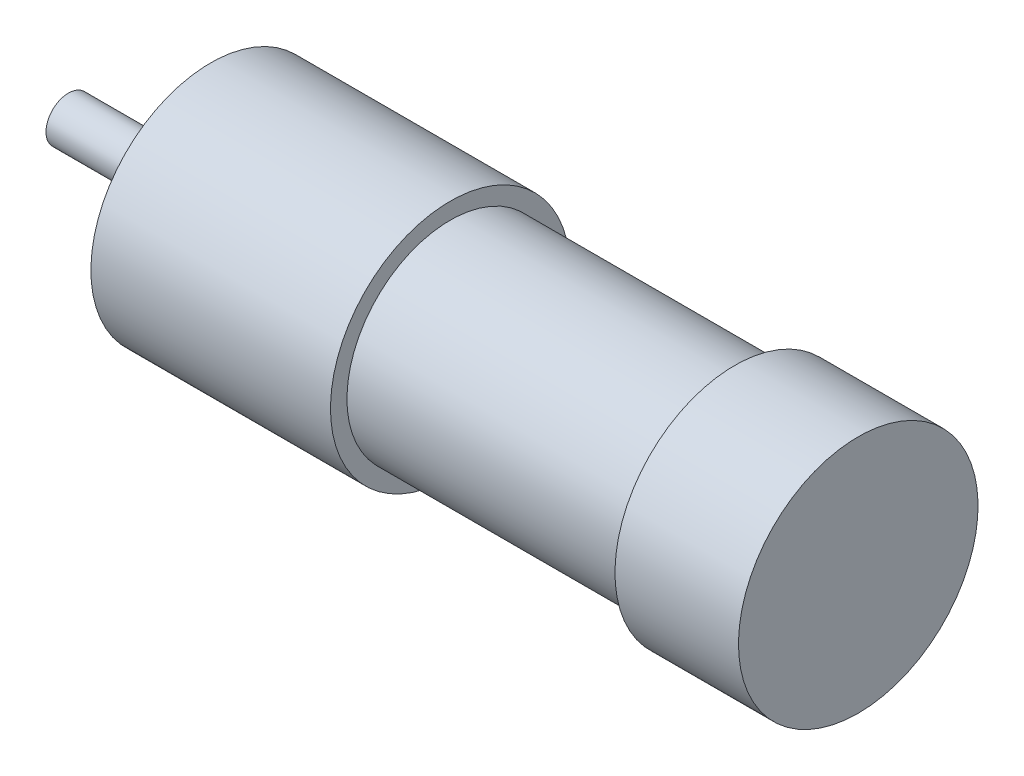
ISO-10303-21;
HEADER;
FILE_DESCRIPTION(('STEP AP214'),'2;1');
FILE_NAME('part.step','',(''),(''),'','','');
FILE_SCHEMA(('AUTOMOTIVE_DESIGN { 1 0 10303 214 1 1 1 1 }'));
ENDSEC;
DATA;
#1=APPLICATION_CONTEXT('core data for automotive mechanical design processes');
#2=APPLICATION_PROTOCOL_DEFINITION('international standard','automotive_design',2000,#1);
#3=PRODUCT_CONTEXT('',#1,'mechanical');
#4=PRODUCT('Part','Part','',(#3));
#5=PRODUCT_RELATED_PRODUCT_CATEGORY('part','',(#4));
#6=PRODUCT_DEFINITION_FORMATION('','',#4);
#7=PRODUCT_DEFINITION_CONTEXT('part definition',#1,'design');
#8=PRODUCT_DEFINITION('design','',#6,#7);
#9=PRODUCT_DEFINITION_SHAPE('','',#8);
#10=(LENGTH_UNIT() NAMED_UNIT(*) SI_UNIT(.MILLI.,.METRE.));
#11=(NAMED_UNIT(*) PLANE_ANGLE_UNIT() SI_UNIT($,.RADIAN.));
#12=(NAMED_UNIT(*) SI_UNIT($,.STERADIAN.) SOLID_ANGLE_UNIT());
#13=UNCERTAINTY_MEASURE_WITH_UNIT(LENGTH_MEASURE(1.E-05),#10,'distance_accuracy_value','');
#14=(GEOMETRIC_REPRESENTATION_CONTEXT(3) GLOBAL_UNCERTAINTY_ASSIGNED_CONTEXT((#13)) GLOBAL_UNIT_ASSIGNED_CONTEXT((#10,
#11,#12)) REPRESENTATION_CONTEXT('',''));
#15=CARTESIAN_POINT('',(0.,0.,0.));
#16=DIRECTION('',(0.,0.,1.));
#17=DIRECTION('',(1.,0.,0.));
#18=AXIS2_PLACEMENT_3D('',#15,#16,#17);
#19=CARTESIAN_POINT('',(0.,0.,0.));
#20=DIRECTION('',(1.,0.,0.));
#21=DIRECTION('',(0.,1.,0.));
#22=AXIS2_PLACEMENT_3D('',#19,#20,#21);
#23=PLANE('',#22);
#24=CARTESIAN_POINT('',(0.,0.,0.));
#25=DIRECTION('',(-1.,0.,0.));
#26=DIRECTION('',(0.,-1.,0.));
#27=AXIS2_PLACEMENT_3D('',#24,#25,#26);
#28=CIRCLE('',#27,3.);
#29=CARTESIAN_POINT('',(0.,-3.,0.));
#30=VERTEX_POINT('',#29);
#31=EDGE_CURVE('E11',#30,#30,#28,.T.);
#32=ORIENTED_EDGE('',*,*,#31,.F.);
#33=EDGE_LOOP('',(#32));
#34=FACE_BOUND('',#33,.T.);
#35=DIRECTION('',(0.,0.,1.));
#36=VECTOR('',#35,1.);
#37=CARTESIAN_POINT('',(0.,-9.,0.));
#38=LINE('',#37,#36);
#39=CARTESIAN_POINT('',(0.,-9.,-4.35889894354067));
#40=VERTEX_POINT('',#39);
#41=CARTESIAN_POINT('',(0.,-9.,4.35889894354067));
#42=VERTEX_POINT('',#41);
#43=EDGE_CURVE('E82',#40,#42,#38,.T.);
#44=ORIENTED_EDGE('',*,*,#43,.T.);
#45=CARTESIAN_POINT('',(0.,0.,0.));
#46=DIRECTION('',(-1.,0.,0.));
#47=DIRECTION('',(0.,-1.,0.));
#48=AXIS2_PLACEMENT_3D('',#45,#46,#47);
#49=CIRCLE('',#48,10.);
#50=CARTESIAN_POINT('',(0.,9.,4.35889894354068));
#51=VERTEX_POINT('',#50);
#52=EDGE_CURVE('E46',#42,#51,#49,.T.);
#53=ORIENTED_EDGE('',*,*,#52,.T.);
#54=DIRECTION('',(0.,0.,1.));
#55=VECTOR('',#54,1.);
#56=CARTESIAN_POINT('',(0.,9.,0.));
#57=LINE('',#56,#55);
#58=CARTESIAN_POINT('',(0.,9.,-4.35889894354068));
#59=VERTEX_POINT('',#58);
#60=EDGE_CURVE('E103',#59,#51,#57,.T.);
#61=ORIENTED_EDGE('',*,*,#60,.F.);
#62=EDGE_CURVE('E99',#59,#40,#49,.T.);
#63=ORIENTED_EDGE('',*,*,#62,.T.);
#64=EDGE_LOOP('',(#44,#53,#61,#63));
#65=FACE_BOUND('',#64,.T.);
#66=ADVANCED_FACE('F43',(#34,#65),#23,.F.);
#67=CARTESIAN_POINT('',(0.,0.,0.));
#68=DIRECTION('',(-1.,0.,0.));
#69=DIRECTION('',(0.,-1.,0.));
#70=AXIS2_PLACEMENT_3D('',#67,#68,#69);
#71=CYLINDRICAL_SURFACE('',#70,10.);
#72=DIRECTION('',(-1.,0.,0.));
#73=VECTOR('',#72,1.);
#74=CARTESIAN_POINT('',(3.,-9.,4.35889894354067));
#75=LINE('',#74,#73);
#76=CARTESIAN_POINT('',(3.,-9.,4.35889894354067));
#77=VERTEX_POINT('',#76);
#78=EDGE_CURVE('E88',#77,#42,#75,.T.);
#79=ORIENTED_EDGE('',*,*,#78,.F.);
#80=CARTESIAN_POINT('',(3.,0.,0.));
#81=DIRECTION('',(-1.,0.,0.));
#82=DIRECTION('',(0.,-1.,0.));
#83=AXIS2_PLACEMENT_3D('',#80,#81,#82);
#84=CIRCLE('',#83,10.);
#85=CARTESIAN_POINT('',(3.,9.,4.35889894354067));
#86=VERTEX_POINT('',#85);
#87=EDGE_CURVE('E104',#77,#86,#84,.T.);
#88=ORIENTED_EDGE('',*,*,#87,.T.);
#89=DIRECTION('',(-1.,0.,0.));
#90=VECTOR('',#89,1.);
#91=CARTESIAN_POINT('',(3.,9.,4.35889894354068));
#92=LINE('',#91,#90);
#93=EDGE_CURVE('E93',#86,#51,#92,.T.);
#94=ORIENTED_EDGE('',*,*,#93,.T.);
#95=ORIENTED_EDGE('',*,*,#52,.F.);
#96=EDGE_LOOP('',(#79,#88,#94,#95));
#97=FACE_BOUND('',#96,.T.);
#98=ADVANCED_FACE('F160',(#97),#71,.T.);
#99=DIRECTION('',(-1.,0.,0.));
#100=VECTOR('',#99,1.);
#101=CARTESIAN_POINT('',(3.,-9.,-4.35889894354067));
#102=LINE('',#101,#100);
#103=CARTESIAN_POINT('',(3.,-9.,-4.35889894354067));
#104=VERTEX_POINT('',#103);
#105=EDGE_CURVE('E85',#104,#40,#102,.T.);
#106=ORIENTED_EDGE('',*,*,#105,.T.);
#107=ORIENTED_EDGE('',*,*,#62,.F.);
#108=DIRECTION('',(-1.,0.,0.));
#109=VECTOR('',#108,1.);
#110=CARTESIAN_POINT('',(3.,9.,-4.35889894354068));
#111=LINE('',#110,#109);
#112=CARTESIAN_POINT('',(3.,9.,-4.35889894354068));
#113=VERTEX_POINT('',#112);
#114=EDGE_CURVE('E154',#113,#59,#111,.T.);
#115=ORIENTED_EDGE('',*,*,#114,.F.);
#116=EDGE_CURVE('E100',#113,#104,#84,.T.);
#117=ORIENTED_EDGE('',*,*,#116,.T.);
#118=EDGE_LOOP('',(#106,#107,#115,#117));
#119=FACE_BOUND('',#118,.T.);
#120=ADVANCED_FACE('F97',(#119),#71,.T.);
#121=CARTESIAN_POINT('',(3.,10.,0.));
#122=DIRECTION('',(1.,0.,0.));
#123=DIRECTION('',(0.,1.,0.));
#124=AXIS2_PLACEMENT_3D('',#121,#122,#123);
#125=PLANE('',#124);
#126=CARTESIAN_POINT('',(3.,9.19238815542484,-9.19238815542514));
#127=DIRECTION('',(-1.,0.,0.));
#128=DIRECTION('',(0.,-1.,0.));
#129=AXIS2_PLACEMENT_3D('',#126,#127,#128);
#130=CIRCLE('',#129,2.);
#131=CARTESIAN_POINT('',(3.,7.19238815542484,-9.19238815542514));
#132=VERTEX_POINT('',#131);
#133=EDGE_CURVE('E137',#132,#132,#130,.T.);
#134=ORIENTED_EDGE('',*,*,#133,.F.);
#135=EDGE_LOOP('',(#134));
#136=FACE_BOUND('',#135,.T.);
#137=CARTESIAN_POINT('',(3.,-9.19238815542539,-9.19238815542484));
#138=DIRECTION('',(-1.,0.,0.));
#139=DIRECTION('',(0.,-1.,0.));
#140=AXIS2_PLACEMENT_3D('',#137,#138,#139);
#141=CIRCLE('',#140,2.);
#142=CARTESIAN_POINT('',(3.,-11.1923881554254,-9.19238815542484));
#143=VERTEX_POINT('',#142);
#144=EDGE_CURVE('E144',#143,#143,#141,.T.);
#145=ORIENTED_EDGE('',*,*,#144,.F.);
#146=EDGE_LOOP('',(#145));
#147=FACE_BOUND('',#146,.T.);
#148=CARTESIAN_POINT('',(3.,-9.1923881554251,9.19238815542539));
#149=DIRECTION('',(-1.,0.,0.));
#150=DIRECTION('',(0.,-1.,0.));
#151=AXIS2_PLACEMENT_3D('',#148,#149,#150);
#152=CIRCLE('',#151,2.);
#153=CARTESIAN_POINT('',(3.,-11.1923881554251,9.19238815542539));
#154=VERTEX_POINT('',#153);
#155=EDGE_CURVE('E131',#154,#154,#152,.T.);
#156=ORIENTED_EDGE('',*,*,#155,.F.);
#157=EDGE_LOOP('',(#156));
#158=FACE_BOUND('',#157,.T.);
#159=CARTESIAN_POINT('',(3.,9.19238815542513,9.1923881554251));
#160=DIRECTION('',(-1.,0.,0.));
#161=DIRECTION('',(0.,-1.,0.));
#162=AXIS2_PLACEMENT_3D('',#159,#160,#161);
#163=CIRCLE('',#162,2.);
#164=CARTESIAN_POINT('',(3.,7.19238815542513,9.1923881554251));
#165=VERTEX_POINT('',#164);
#166=EDGE_CURVE('E128',#165,#165,#163,.T.);
#167=ORIENTED_EDGE('',*,*,#166,.F.);
#168=EDGE_LOOP('',(#167));
#169=FACE_BOUND('',#168,.T.);
#170=ORIENTED_EDGE('',*,*,#87,.F.);
#171=DIRECTION('',(0.,0.,1.));
#172=VECTOR('',#171,1.);
#173=CARTESIAN_POINT('',(3.,-9.,0.));
#174=LINE('',#173,#172);
#175=EDGE_CURVE('E58',#104,#77,#174,.T.);
#176=ORIENTED_EDGE('',*,*,#175,.F.);
#177=ORIENTED_EDGE('',*,*,#116,.F.);
#178=DIRECTION('',(0.,0.,1.));
#179=VECTOR('',#178,1.);
#180=CARTESIAN_POINT('',(3.,9.,0.));
#181=LINE('',#180,#179);
#182=EDGE_CURVE('E63',#113,#86,#181,.T.);
#183=ORIENTED_EDGE('',*,*,#182,.T.);
#184=EDGE_LOOP('',(#170,#176,#177,#183));
#185=FACE_BOUND('',#184,.T.);
#186=CARTESIAN_POINT('',(3.,0.,0.));
#187=DIRECTION('',(-1.,0.,0.));
#188=DIRECTION('',(0.,-1.,0.));
#189=AXIS2_PLACEMENT_3D('',#186,#187,#188);
#190=CIRCLE('',#189,16.);
#191=CARTESIAN_POINT('',(3.,-16.,0.));
#192=VERTEX_POINT('',#191);
#193=EDGE_CURVE('E108',#192,#192,#190,.T.);
#194=ORIENTED_EDGE('',*,*,#193,.T.);
#195=EDGE_LOOP('',(#194));
#196=FACE_BOUND('',#195,.T.);
#197=ADVANCED_FACE('F161',(#136,#147,#158,#169,#185,#196),#125,.F.);
#198=CARTESIAN_POINT('',(0.,0.,0.));
#199=DIRECTION('',(-1.,0.,0.));
#200=DIRECTION('',(0.,-1.,0.));
#201=AXIS2_PLACEMENT_3D('',#198,#199,#200);
#202=CYLINDRICAL_SURFACE('',#201,16.);
#203=ORIENTED_EDGE('',*,*,#193,.F.);
#204=EDGE_LOOP('',(#203));
#205=FACE_BOUND('',#204,.T.);
#206=CARTESIAN_POINT('',(35.,0.,0.));
#207=DIRECTION('',(-1.,0.,0.));
#208=DIRECTION('',(0.,-1.,0.));
#209=AXIS2_PLACEMENT_3D('',#206,#207,#208);
#210=CIRCLE('',#209,16.);
#211=CARTESIAN_POINT('',(35.,-16.,0.));
#212=VERTEX_POINT('',#211);
#213=EDGE_CURVE('E112',#212,#212,#210,.T.);
#214=ORIENTED_EDGE('',*,*,#213,.T.);
#215=EDGE_LOOP('',(#214));
#216=FACE_BOUND('',#215,.T.);
#217=ADVANCED_FACE('F164',(#205,#216),#202,.T.);
#218=CARTESIAN_POINT('',(35.,16.,0.));
#219=DIRECTION('',(-1.,0.,0.));
#220=DIRECTION('',(0.,-1.,0.));
#221=AXIS2_PLACEMENT_3D('',#218,#219,#220);
#222=PLANE('',#221);
#223=ORIENTED_EDGE('',*,*,#213,.F.);
#224=EDGE_LOOP('',(#223));
#225=FACE_BOUND('',#224,.T.);
#226=CARTESIAN_POINT('',(35.,0.,0.));
#227=DIRECTION('',(-1.,0.,0.));
#228=DIRECTION('',(0.,-1.,0.));
#229=AXIS2_PLACEMENT_3D('',#226,#227,#228);
#230=CIRCLE('',#229,13.8);
#231=CARTESIAN_POINT('',(35.,-13.8,0.));
#232=VERTEX_POINT('',#231);
#233=EDGE_CURVE('E115',#232,#232,#230,.T.);
#234=ORIENTED_EDGE('',*,*,#233,.T.);
#235=EDGE_LOOP('',(#234));
#236=FACE_BOUND('',#235,.T.);
#237=ADVANCED_FACE('F171',(#225,#236),#222,.F.);
#238=CARTESIAN_POINT('',(0.,0.,0.));
#239=DIRECTION('',(-1.,0.,0.));
#240=DIRECTION('',(0.,-1.,0.));
#241=AXIS2_PLACEMENT_3D('',#238,#239,#240);
#242=CYLINDRICAL_SURFACE('',#241,13.8);
#243=ORIENTED_EDGE('',*,*,#233,.F.);
#244=EDGE_LOOP('',(#243));
#245=FACE_BOUND('',#244,.T.);
#246=CARTESIAN_POINT('',(73.,0.,0.));
#247=DIRECTION('',(-1.,0.,0.));
#248=DIRECTION('',(0.,-1.,0.));
#249=AXIS2_PLACEMENT_3D('',#246,#247,#248);
#250=CIRCLE('',#249,13.8);
#251=CARTESIAN_POINT('',(73.,-13.8,0.));
#252=VERTEX_POINT('',#251);
#253=EDGE_CURVE('E118',#252,#252,#250,.T.);
#254=ORIENTED_EDGE('',*,*,#253,.T.);
#255=EDGE_LOOP('',(#254));
#256=FACE_BOUND('',#255,.T.);
#257=ADVANCED_FACE('F177',(#245,#256),#242,.T.);
#258=CARTESIAN_POINT('',(89.5,0.,0.));
#259=DIRECTION('',(-1.,0.,0.));
#260=DIRECTION('',(0.,-1.,0.));
#261=AXIS2_PLACEMENT_3D('',#258,#259,#260);
#262=PLANE('',#261);
#263=CARTESIAN_POINT('',(89.5,0.,0.));
#264=DIRECTION('',(-1.,0.,0.));
#265=DIRECTION('',(0.,-1.,0.));
#266=AXIS2_PLACEMENT_3D('',#263,#264,#265);
#267=CIRCLE('',#266,16.);
#268=CARTESIAN_POINT('',(89.5,-16.,0.));
#269=VERTEX_POINT('',#268);
#270=EDGE_CURVE('E121',#269,#269,#267,.T.);
#271=ORIENTED_EDGE('',*,*,#270,.F.);
#272=EDGE_LOOP('',(#271));
#273=FACE_BOUND('',#272,.T.);
#274=ADVANCED_FACE('F183',(#273),#262,.F.);
#275=CARTESIAN_POINT('',(73.,0.,0.));
#276=DIRECTION('',(-1.,0.,0.));
#277=DIRECTION('',(0.,-1.,0.));
#278=AXIS2_PLACEMENT_3D('',#275,#276,#277);
#279=CYLINDRICAL_SURFACE('',#278,16.);
#280=CARTESIAN_POINT('',(73.,0.,0.));
#281=DIRECTION('',(-1.,0.,0.));
#282=DIRECTION('',(0.,-1.,0.));
#283=AXIS2_PLACEMENT_3D('',#280,#281,#282);
#284=CIRCLE('',#283,16.);
#285=CARTESIAN_POINT('',(73.,-16.,0.));
#286=VERTEX_POINT('',#285);
#287=EDGE_CURVE('E124',#286,#286,#284,.T.);
#288=ORIENTED_EDGE('',*,*,#287,.F.);
#289=EDGE_LOOP('',(#288));
#290=FACE_BOUND('',#289,.T.);
#291=ORIENTED_EDGE('',*,*,#270,.T.);
#292=EDGE_LOOP('',(#291));
#293=FACE_BOUND('',#292,.T.);
#294=ADVANCED_FACE('F191',(#290,#293),#279,.T.);
#295=CARTESIAN_POINT('',(73.,16.,0.));
#296=DIRECTION('',(1.,0.,0.));
#297=DIRECTION('',(0.,1.,0.));
#298=AXIS2_PLACEMENT_3D('',#295,#296,#297);
#299=PLANE('',#298);
#300=ORIENTED_EDGE('',*,*,#253,.F.);
#301=EDGE_LOOP('',(#300));
#302=FACE_BOUND('',#301,.T.);
#303=ORIENTED_EDGE('',*,*,#287,.T.);
#304=EDGE_LOOP('',(#303));
#305=FACE_BOUND('',#304,.T.);
#306=ADVANCED_FACE('F187',(#302,#305),#299,.F.);
#307=CARTESIAN_POINT('',(11.,9.19238815542513,9.1923881554251));
#308=DIRECTION('',(-1.,0.,0.));
#309=DIRECTION('',(0.,-1.,0.));
#310=AXIS2_PLACEMENT_3D('',#307,#308,#309);
#311=CYLINDRICAL_SURFACE('',#310,2.);
#312=CARTESIAN_POINT('',(11.,9.19238815542513,9.1923881554251));
#313=DIRECTION('',(-1.,0.,0.));
#314=DIRECTION('',(0.,-1.,0.));
#315=AXIS2_PLACEMENT_3D('',#312,#313,#314);
#316=CIRCLE('',#315,2.);
#317=CARTESIAN_POINT('',(11.,7.19238815542513,9.1923881554251));
#318=VERTEX_POINT('',#317);
#319=EDGE_CURVE('E127',#318,#318,#316,.T.);
#320=ORIENTED_EDGE('',*,*,#319,.F.);
#321=EDGE_LOOP('',(#320));
#322=FACE_BOUND('',#321,.T.);
#323=ORIENTED_EDGE('',*,*,#166,.T.);
#324=EDGE_LOOP('',(#323));
#325=FACE_BOUND('',#324,.T.);
#326=ADVANCED_FACE('F190',(#322,#325),#311,.F.);
#327=CARTESIAN_POINT('',(11.,9.19238815542513,9.1923881554251));
#328=DIRECTION('',(-1.,0.,0.));
#329=DIRECTION('',(0.,-1.,0.));
#330=AXIS2_PLACEMENT_3D('',#327,#328,#329);
#331=PLANE('',#330);
#332=ORIENTED_EDGE('',*,*,#319,.T.);
#333=EDGE_LOOP('',(#332));
#334=FACE_BOUND('',#333,.T.);
#335=ADVANCED_FACE('F234',(#334),#331,.T.);
#336=CARTESIAN_POINT('',(11.,-9.1923881554251,9.19238815542539));
#337=DIRECTION('',(-1.,0.,0.));
#338=DIRECTION('',(0.,-1.,0.));
#339=AXIS2_PLACEMENT_3D('',#336,#337,#338);
#340=CYLINDRICAL_SURFACE('',#339,2.);
#341=CARTESIAN_POINT('',(11.,-9.1923881554251,9.19238815542539));
#342=DIRECTION('',(-1.,0.,0.));
#343=DIRECTION('',(0.,-1.,0.));
#344=AXIS2_PLACEMENT_3D('',#341,#342,#343);
#345=CIRCLE('',#344,2.);
#346=CARTESIAN_POINT('',(11.,-11.1923881554251,9.19238815542539));
#347=VERTEX_POINT('',#346);
#348=EDGE_CURVE('E147',#347,#347,#345,.T.);
#349=ORIENTED_EDGE('',*,*,#348,.F.);
#350=EDGE_LOOP('',(#349));
#351=FACE_BOUND('',#350,.T.);
#352=ORIENTED_EDGE('',*,*,#155,.T.);
#353=EDGE_LOOP('',(#352));
#354=FACE_BOUND('',#353,.T.);
#355=ADVANCED_FACE('F230',(#351,#354),#340,.F.);
#356=CARTESIAN_POINT('',(11.,-9.1923881554251,9.19238815542539));
#357=DIRECTION('',(-1.,0.,0.));
#358=DIRECTION('',(0.,-1.,0.));
#359=AXIS2_PLACEMENT_3D('',#356,#357,#358);
#360=PLANE('',#359);
#361=ORIENTED_EDGE('',*,*,#348,.T.);
#362=EDGE_LOOP('',(#361));
#363=FACE_BOUND('',#362,.T.);
#364=ADVANCED_FACE('F233',(#363),#360,.T.);
#365=CARTESIAN_POINT('',(11.,-9.19238815542539,-9.19238815542484));
#366=DIRECTION('',(-1.,0.,0.));
#367=DIRECTION('',(0.,-1.,0.));
#368=AXIS2_PLACEMENT_3D('',#365,#366,#367);
#369=CYLINDRICAL_SURFACE('',#368,2.);
#370=CARTESIAN_POINT('',(11.,-9.19238815542539,-9.19238815542484));
#371=DIRECTION('',(-1.,0.,0.));
#372=DIRECTION('',(0.,-1.,0.));
#373=AXIS2_PLACEMENT_3D('',#370,#371,#372);
#374=CIRCLE('',#373,2.);
#375=CARTESIAN_POINT('',(11.,-11.1923881554254,-9.19238815542484));
#376=VERTEX_POINT('',#375);
#377=EDGE_CURVE('E141',#376,#376,#374,.T.);
#378=ORIENTED_EDGE('',*,*,#377,.F.);
#379=EDGE_LOOP('',(#378));
#380=FACE_BOUND('',#379,.T.);
#381=ORIENTED_EDGE('',*,*,#144,.T.);
#382=EDGE_LOOP('',(#381));
#383=FACE_BOUND('',#382,.T.);
#384=ADVANCED_FACE('F238',(#380,#383),#369,.F.);
#385=CARTESIAN_POINT('',(11.,-9.19238815542539,-9.19238815542484));
#386=DIRECTION('',(-1.,0.,0.));
#387=DIRECTION('',(0.,-1.,0.));
#388=AXIS2_PLACEMENT_3D('',#385,#386,#387);
#389=PLANE('',#388);
#390=ORIENTED_EDGE('',*,*,#377,.T.);
#391=EDGE_LOOP('',(#390));
#392=FACE_BOUND('',#391,.T.);
#393=ADVANCED_FACE('F242',(#392),#389,.T.);
#394=CARTESIAN_POINT('',(11.,9.19238815542484,-9.19238815542514));
#395=DIRECTION('',(-1.,0.,0.));
#396=DIRECTION('',(0.,-1.,0.));
#397=AXIS2_PLACEMENT_3D('',#394,#395,#396);
#398=CYLINDRICAL_SURFACE('',#397,2.);
#399=CARTESIAN_POINT('',(11.,9.19238815542484,-9.19238815542514));
#400=DIRECTION('',(-1.,0.,0.));
#401=DIRECTION('',(0.,-1.,0.));
#402=AXIS2_PLACEMENT_3D('',#399,#400,#401);
#403=CIRCLE('',#402,2.);
#404=CARTESIAN_POINT('',(11.,7.19238815542484,-9.19238815542514));
#405=VERTEX_POINT('',#404);
#406=EDGE_CURVE('E134',#405,#405,#403,.T.);
#407=ORIENTED_EDGE('',*,*,#406,.F.);
#408=EDGE_LOOP('',(#407));
#409=FACE_BOUND('',#408,.T.);
#410=ORIENTED_EDGE('',*,*,#133,.T.);
#411=EDGE_LOOP('',(#410));
#412=FACE_BOUND('',#411,.T.);
#413=ADVANCED_FACE('F224',(#409,#412),#398,.F.);
#414=CARTESIAN_POINT('',(11.,9.19238815542484,-9.19238815542514));
#415=DIRECTION('',(-1.,0.,0.));
#416=DIRECTION('',(0.,-1.,0.));
#417=AXIS2_PLACEMENT_3D('',#414,#415,#416);
#418=PLANE('',#417);
#419=ORIENTED_EDGE('',*,*,#406,.T.);
#420=EDGE_LOOP('',(#419));
#421=FACE_BOUND('',#420,.T.);
#422=ADVANCED_FACE('F215',(#421),#418,.T.);
#423=CARTESIAN_POINT('',(-16.,0.,0.));
#424=DIRECTION('',(1.,0.,0.));
#425=DIRECTION('',(0.,1.,0.));
#426=AXIS2_PLACEMENT_3D('',#423,#424,#425);
#427=CYLINDRICAL_SURFACE('',#426,3.);
#428=CARTESIAN_POINT('',(-16.,0.,0.));
#429=DIRECTION('',(-1.,0.,0.));
#430=DIRECTION('',(0.,-1.,0.));
#431=AXIS2_PLACEMENT_3D('',#428,#429,#430);
#432=CIRCLE('',#431,3.);
#433=CARTESIAN_POINT('',(-16.,-3.,0.));
#434=VERTEX_POINT('',#433);
#435=EDGE_CURVE('E138',#434,#434,#432,.T.);
#436=ORIENTED_EDGE('',*,*,#435,.F.);
#437=EDGE_LOOP('',(#436));
#438=FACE_BOUND('',#437,.T.);
#439=ORIENTED_EDGE('',*,*,#31,.T.);
#440=EDGE_LOOP('',(#439));
#441=FACE_BOUND('',#440,.T.);
#442=ADVANCED_FACE('F212',(#438,#441),#427,.T.);
#443=CARTESIAN_POINT('',(-16.,0.,0.));
#444=DIRECTION('',(-1.,0.,0.));
#445=DIRECTION('',(0.,-1.,0.));
#446=AXIS2_PLACEMENT_3D('',#443,#444,#445);
#447=PLANE('',#446);
#448=ORIENTED_EDGE('',*,*,#435,.T.);
#449=EDGE_LOOP('',(#448));
#450=FACE_BOUND('',#449,.T.);
#451=ADVANCED_FACE('F214',(#450),#447,.T.);
#452=CARTESIAN_POINT('',(3.,9.,0.));
#453=DIRECTION('',(0.,-1.,0.));
#454=DIRECTION('',(1.,0.,0.));
#455=AXIS2_PLACEMENT_3D('',#452,#453,#454);
#456=PLANE('',#455);
#457=ORIENTED_EDGE('',*,*,#60,.T.);
#458=ORIENTED_EDGE('',*,*,#93,.F.);
#459=ORIENTED_EDGE('',*,*,#182,.F.);
#460=ORIENTED_EDGE('',*,*,#114,.T.);
#461=EDGE_LOOP('',(#457,#458,#459,#460));
#462=FACE_BOUND('',#461,.T.);
#463=ADVANCED_FACE('F221',(#462),#456,.F.);
#464=CARTESIAN_POINT('',(3.,-9.,0.));
#465=DIRECTION('',(0.,-1.,0.));
#466=DIRECTION('',(1.,0.,0.));
#467=AXIS2_PLACEMENT_3D('',#464,#465,#466);
#468=PLANE('',#467);
#469=ORIENTED_EDGE('',*,*,#43,.F.);
#470=ORIENTED_EDGE('',*,*,#105,.F.);
#471=ORIENTED_EDGE('',*,*,#175,.T.);
#472=ORIENTED_EDGE('',*,*,#78,.T.);
#473=EDGE_LOOP('',(#469,#470,#471,#472));
#474=FACE_BOUND('',#473,.T.);
#475=ADVANCED_FACE('F84',(#474),#468,.T.);
#476=CLOSED_SHELL('',(#66,#98,#120,#197,#217,#237,#257,#274,#294,#306,#326,#335,#355,#364,#384,
#393,#413,#422,#442,#451,#463,#475));
#477=MANIFOLD_SOLID_BREP('B2',#476);
#478=ADVANCED_BREP_SHAPE_REPRESENTATION('',(#18,#477),#14);
#479=SHAPE_DEFINITION_REPRESENTATION(#9,#478);
ENDSEC;
END-ISO-10303-21;
